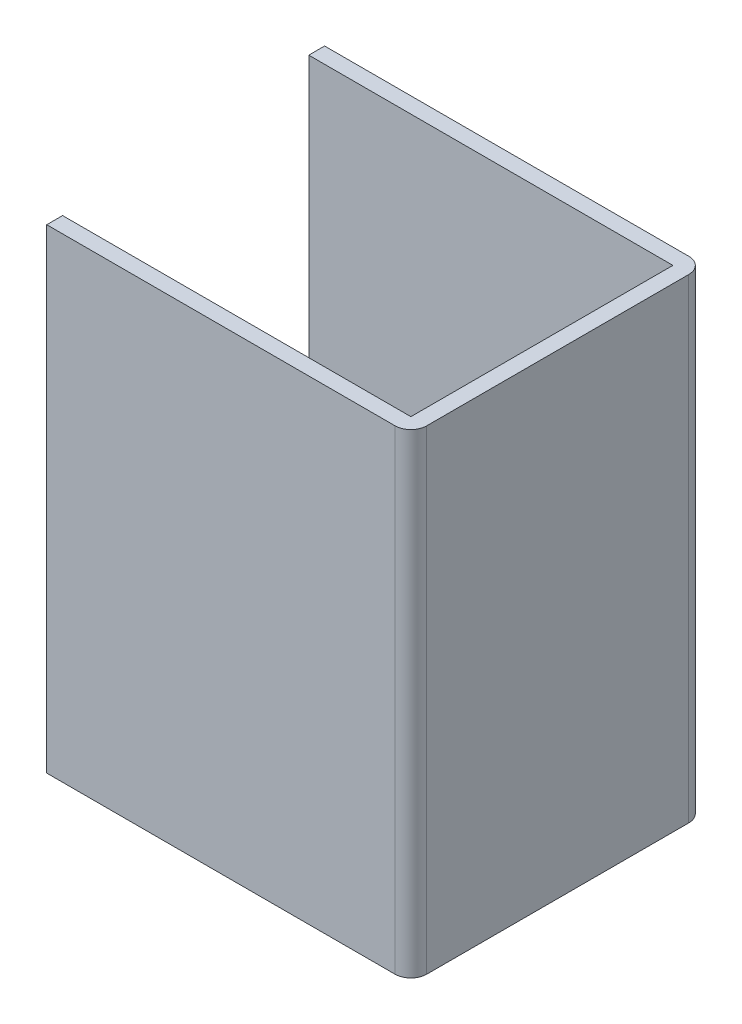
ISO-10303-21;
HEADER;
FILE_DESCRIPTION(('STEP AP214'),'2;1');
FILE_NAME('part.step','',(''),(''),'','','');
FILE_SCHEMA(('AUTOMOTIVE_DESIGN { 1 0 10303 214 1 1 1 1 }'));
ENDSEC;
DATA;
#1=APPLICATION_CONTEXT('core data for automotive mechanical design processes');
#2=APPLICATION_PROTOCOL_DEFINITION('international standard','automotive_design',2000,#1);
#3=PRODUCT_CONTEXT('',#1,'mechanical');
#4=PRODUCT('Part','Part','',(#3));
#5=PRODUCT_RELATED_PRODUCT_CATEGORY('part','',(#4));
#6=PRODUCT_DEFINITION_FORMATION('','',#4);
#7=PRODUCT_DEFINITION_CONTEXT('part definition',#1,'design');
#8=PRODUCT_DEFINITION('design','',#6,#7);
#9=PRODUCT_DEFINITION_SHAPE('','',#8);
#10=(LENGTH_UNIT() NAMED_UNIT(*) SI_UNIT(.MILLI.,.METRE.));
#11=(NAMED_UNIT(*) PLANE_ANGLE_UNIT() SI_UNIT($,.RADIAN.));
#12=(NAMED_UNIT(*) SI_UNIT($,.STERADIAN.) SOLID_ANGLE_UNIT());
#13=UNCERTAINTY_MEASURE_WITH_UNIT(LENGTH_MEASURE(1.E-05),#10,'distance_accuracy_value','');
#14=(GEOMETRIC_REPRESENTATION_CONTEXT(3) GLOBAL_UNCERTAINTY_ASSIGNED_CONTEXT((#13)) GLOBAL_UNIT_ASSIGNED_CONTEXT((#10,
#11,#12)) REPRESENTATION_CONTEXT('',''));
#15=CARTESIAN_POINT('',(0.,0.,0.));
#16=DIRECTION('',(0.,0.,1.));
#17=DIRECTION('',(1.,0.,0.));
#18=AXIS2_PLACEMENT_3D('',#15,#16,#17);
#19=CARTESIAN_POINT('',(3.2,-1.5,1.755));
#20=DIRECTION('',(1.,0.,0.));
#21=DIRECTION('',(0.,0.,-1.));
#22=AXIS2_PLACEMENT_3D('',#19,#20,#21);
#23=PLANE('',#22);
#24=DIRECTION('',(0.,0.,-1.));
#25=VECTOR('',#24,1.);
#26=CARTESIAN_POINT('',(3.2,1.5,1.755));
#27=LINE('',#26,#25);
#28=CARTESIAN_POINT('',(3.2,1.5,1.755));
#29=VERTEX_POINT('',#28);
#30=CARTESIAN_POINT('',(3.2,1.5,1.855));
#31=VERTEX_POINT('',#30);
#32=EDGE_CURVE('E76',#29,#31,#27,.F.);
#33=ORIENTED_EDGE('',*,*,#32,.F.);
#34=DIRECTION('',(0.,1.,0.));
#35=VECTOR('',#34,1.);
#36=CARTESIAN_POINT('',(3.2,-1.5,1.755));
#37=LINE('',#36,#35);
#38=CARTESIAN_POINT('',(3.2,-1.5,1.755));
#39=VERTEX_POINT('',#38);
#40=EDGE_CURVE('E100',#29,#39,#37,.F.);
#41=ORIENTED_EDGE('',*,*,#40,.T.);
#42=DIRECTION('',(0.,0.,-1.));
#43=VECTOR('',#42,1.);
#44=CARTESIAN_POINT('',(3.2,-1.5,1.755));
#45=LINE('',#44,#43);
#46=CARTESIAN_POINT('',(3.2,-1.5,1.855));
#47=VERTEX_POINT('',#46);
#48=EDGE_CURVE('E92',#47,#39,#45,.T.);
#49=ORIENTED_EDGE('',*,*,#48,.F.);
#50=DIRECTION('',(0.,1.,0.));
#51=VECTOR('',#50,1.);
#52=CARTESIAN_POINT('',(3.2,0.,1.855));
#53=LINE('',#52,#51);
#54=EDGE_CURVE('E97',#31,#47,#53,.F.);
#55=ORIENTED_EDGE('',*,*,#54,.F.);
#56=EDGE_LOOP('',(#33,#41,#49,#55));
#57=FACE_BOUND('',#56,.T.);
#58=ADVANCED_FACE('F17',(#57),#23,.F.);
#59=CARTESIAN_POINT('',(5.4,-1.5,0.));
#60=DIRECTION('',(1.,0.,0.));
#61=DIRECTION('',(0.,0.,-1.));
#62=AXIS2_PLACEMENT_3D('',#59,#60,#61);
#63=PLANE('',#62);
#64=DIRECTION('',(0.,0.,-1.));
#65=VECTOR('',#64,1.);
#66=CARTESIAN_POINT('',(5.4,1.5,0.));
#67=LINE('',#66,#65);
#68=CARTESIAN_POINT('',(5.4,1.5,0.1));
#69=VERTEX_POINT('',#68);
#70=CARTESIAN_POINT('',(5.4,1.5,1.755));
#71=VERTEX_POINT('',#70);
#72=EDGE_CURVE('E160',#69,#71,#67,.F.);
#73=ORIENTED_EDGE('',*,*,#72,.F.);
#74=DIRECTION('',(0.,1.,0.));
#75=VECTOR('',#74,1.);
#76=CARTESIAN_POINT('',(5.4,-1.5,0.1));
#77=LINE('',#76,#75);
#78=CARTESIAN_POINT('',(5.4,-1.5,0.1));
#79=VERTEX_POINT('',#78);
#80=EDGE_CURVE('E108',#79,#69,#77,.T.);
#81=ORIENTED_EDGE('',*,*,#80,.F.);
#82=DIRECTION('',(0.,0.,-1.));
#83=VECTOR('',#82,1.);
#84=CARTESIAN_POINT('',(5.4,-1.5,0.));
#85=LINE('',#84,#83);
#86=CARTESIAN_POINT('',(5.4,-1.5,1.755));
#87=VERTEX_POINT('',#86);
#88=EDGE_CURVE('E157',#87,#79,#85,.T.);
#89=ORIENTED_EDGE('',*,*,#88,.F.);
#90=DIRECTION('',(0.,1.,0.));
#91=VECTOR('',#90,1.);
#92=CARTESIAN_POINT('',(5.4,-1.5,1.755));
#93=LINE('',#92,#91);
#94=EDGE_CURVE('E146',#87,#71,#93,.T.);
#95=ORIENTED_EDGE('',*,*,#94,.T.);
#96=EDGE_LOOP('',(#73,#81,#89,#95));
#97=FACE_BOUND('',#96,.T.);
#98=ADVANCED_FACE('F227',(#97),#63,.F.);
#99=CARTESIAN_POINT('',(5.4,-1.5,1.755));
#100=DIRECTION('',(0.,1.,0.));
#101=DIRECTION('',(0.,0.,1.));
#102=AXIS2_PLACEMENT_3D('',#99,#100,#101);
#103=CYLINDRICAL_SURFACE('',#102,0.1);
#104=DIRECTION('',(0.,1.,0.));
#105=VECTOR('',#104,1.);
#106=CARTESIAN_POINT('',(5.4,0.,1.855));
#107=LINE('',#106,#105);
#108=CARTESIAN_POINT('',(5.4,-1.5,1.855));
#109=VERTEX_POINT('',#108);
#110=CARTESIAN_POINT('',(5.4,1.5,1.855));
#111=VERTEX_POINT('',#110);
#112=EDGE_CURVE('E109',#109,#111,#107,.T.);
#113=ORIENTED_EDGE('',*,*,#112,.F.);
#114=CARTESIAN_POINT('',(5.4,-1.5,1.755));
#115=DIRECTION('',(0.,1.,0.));
#116=DIRECTION('',(0.,0.,1.));
#117=AXIS2_PLACEMENT_3D('',#114,#115,#116);
#118=CIRCLE('',#117,0.1);
#119=CARTESIAN_POINT('',(5.5,-1.5,1.755));
#120=VERTEX_POINT('',#119);
#121=EDGE_CURVE('E113',#109,#120,#118,.T.);
#122=ORIENTED_EDGE('',*,*,#121,.T.);
#123=DIRECTION('',(0.,1.,0.));
#124=VECTOR('',#123,1.);
#125=CARTESIAN_POINT('',(5.5,-1.5,1.755));
#126=LINE('',#125,#124);
#127=CARTESIAN_POINT('',(5.5,1.5,1.755));
#128=VERTEX_POINT('',#127);
#129=EDGE_CURVE('E119',#128,#120,#126,.F.);
#130=ORIENTED_EDGE('',*,*,#129,.F.);
#131=CARTESIAN_POINT('',(5.4,1.5,1.755));
#132=DIRECTION('',(0.,1.,0.));
#133=DIRECTION('',(0.,0.,1.));
#134=AXIS2_PLACEMENT_3D('',#131,#132,#133);
#135=CIRCLE('',#134,0.1);
#136=EDGE_CURVE('E20',#128,#111,#135,.F.);
#137=ORIENTED_EDGE('',*,*,#136,.T.);
#138=EDGE_LOOP('',(#113,#122,#130,#137));
#139=FACE_BOUND('',#138,.T.);
#140=ADVANCED_FACE('F187',(#139),#103,.T.);
#141=CARTESIAN_POINT('',(4.35,0.,1.855));
#142=DIRECTION('',(0.,0.,1.));
#143=DIRECTION('',(1.,0.,0.));
#144=AXIS2_PLACEMENT_3D('',#141,#142,#143);
#145=PLANE('',#144);
#146=DIRECTION('',(-1.,0.,0.));
#147=VECTOR('',#146,1.);
#148=CARTESIAN_POINT('',(4.595623547637,1.5,1.855));
#149=LINE('',#148,#147);
#150=EDGE_CURVE('E107',#31,#111,#149,.F.);
#151=ORIENTED_EDGE('',*,*,#150,.F.);
#152=ORIENTED_EDGE('',*,*,#54,.T.);
#153=DIRECTION('',(1.,0.,0.));
#154=VECTOR('',#153,1.);
#155=CARTESIAN_POINT('',(4.595623547637,-1.5,1.855));
#156=LINE('',#155,#154);
#157=EDGE_CURVE('E106',#109,#47,#156,.F.);
#158=ORIENTED_EDGE('',*,*,#157,.F.);
#159=ORIENTED_EDGE('',*,*,#112,.T.);
#160=EDGE_LOOP('',(#151,#152,#158,#159));
#161=FACE_BOUND('',#160,.T.);
#162=ADVANCED_FACE('F105',(#161),#145,.T.);
#163=CARTESIAN_POINT('',(3.1,-1.5,0.1));
#164=DIRECTION('',(0.,0.,1.));
#165=DIRECTION('',(1.,0.,0.));
#166=AXIS2_PLACEMENT_3D('',#163,#164,#165);
#167=PLANE('',#166);
#168=ORIENTED_EDGE('',*,*,#80,.T.);
#169=DIRECTION('',(-1.,0.,0.));
#170=VECTOR('',#169,1.);
#171=CARTESIAN_POINT('',(4.595623547637,1.5,0.1));
#172=LINE('',#171,#170);
#173=CARTESIAN_POINT('',(3.1,1.5,0.1));
#174=VERTEX_POINT('',#173);
#175=EDGE_CURVE('E137',#174,#69,#172,.F.);
#176=ORIENTED_EDGE('',*,*,#175,.F.);
#177=DIRECTION('',(0.,1.,0.));
#178=VECTOR('',#177,1.);
#179=CARTESIAN_POINT('',(3.1,-1.5,0.1));
#180=LINE('',#179,#178);
#181=CARTESIAN_POINT('',(3.1,-1.5,0.1));
#182=VERTEX_POINT('',#181);
#183=EDGE_CURVE('E131',#174,#182,#180,.F.);
#184=ORIENTED_EDGE('',*,*,#183,.T.);
#185=DIRECTION('',(1.,0.,0.));
#186=VECTOR('',#185,1.);
#187=CARTESIAN_POINT('',(4.595623547637,-1.5,0.1));
#188=LINE('',#187,#186);
#189=EDGE_CURVE('E117',#79,#182,#188,.F.);
#190=ORIENTED_EDGE('',*,*,#189,.F.);
#191=EDGE_LOOP('',(#168,#176,#184,#190));
#192=FACE_BOUND('',#191,.T.);
#193=ADVANCED_FACE('F230',(#192),#167,.T.);
#194=CARTESIAN_POINT('',(3.2,-1.5,1.755));
#195=DIRECTION('',(0.,0.,1.));
#196=DIRECTION('',(1.,0.,0.));
#197=AXIS2_PLACEMENT_3D('',#194,#195,#196);
#198=PLANE('',#197);
#199=ORIENTED_EDGE('',*,*,#94,.F.);
#200=DIRECTION('',(1.,0.,0.));
#201=VECTOR('',#200,1.);
#202=CARTESIAN_POINT('',(4.595623547637,-1.5,1.755));
#203=LINE('',#202,#201);
#204=EDGE_CURVE('E114',#39,#87,#203,.T.);
#205=ORIENTED_EDGE('',*,*,#204,.F.);
#206=ORIENTED_EDGE('',*,*,#40,.F.);
#207=DIRECTION('',(-1.,0.,0.));
#208=VECTOR('',#207,1.);
#209=CARTESIAN_POINT('',(4.595623547637,1.5,1.755));
#210=LINE('',#209,#208);
#211=EDGE_CURVE('E140',#71,#29,#210,.T.);
#212=ORIENTED_EDGE('',*,*,#211,.F.);
#213=EDGE_LOOP('',(#199,#205,#206,#212));
#214=FACE_BOUND('',#213,.T.);
#215=ADVANCED_FACE('F236',(#214),#198,.F.);
#216=CARTESIAN_POINT('',(5.5,-1.5,0.));
#217=DIRECTION('',(1.,0.,0.));
#218=DIRECTION('',(0.,0.,-1.));
#219=AXIS2_PLACEMENT_3D('',#216,#217,#218);
#220=PLANE('',#219);
#221=DIRECTION('',(0.,0.,1.));
#222=VECTOR('',#221,1.);
#223=CARTESIAN_POINT('',(5.5,1.5,0.913905886909));
#224=LINE('',#223,#222);
#225=CARTESIAN_POINT('',(5.5,1.5,0.1));
#226=VERTEX_POINT('',#225);
#227=EDGE_CURVE('E193',#128,#226,#224,.F.);
#228=ORIENTED_EDGE('',*,*,#227,.F.);
#229=ORIENTED_EDGE('',*,*,#129,.T.);
#230=DIRECTION('',(0.,0.,1.));
#231=VECTOR('',#230,1.);
#232=CARTESIAN_POINT('',(5.5,-1.5,0.913905886909));
#233=LINE('',#232,#231);
#234=CARTESIAN_POINT('',(5.5,-1.5,0.1));
#235=VERTEX_POINT('',#234);
#236=EDGE_CURVE('E115',#235,#120,#233,.T.);
#237=ORIENTED_EDGE('',*,*,#236,.F.);
#238=DIRECTION('',(0.,1.,0.));
#239=VECTOR('',#238,1.);
#240=CARTESIAN_POINT('',(5.5,-1.5,0.1));
#241=LINE('',#240,#239);
#242=EDGE_CURVE('E127',#226,#235,#241,.F.);
#243=ORIENTED_EDGE('',*,*,#242,.F.);
#244=EDGE_LOOP('',(#228,#229,#237,#243));
#245=FACE_BOUND('',#244,.T.);
#246=ADVANCED_FACE('F190',(#245),#220,.T.);
#247=CARTESIAN_POINT('',(4.595623547637,-1.5,0.913905886909));
#248=DIRECTION('',(0.,-1.,0.));
#249=DIRECTION('',(1.,0.,0.));
#250=AXIS2_PLACEMENT_3D('',#247,#248,#249);
#251=PLANE('',#250);
#252=ORIENTED_EDGE('',*,*,#189,.T.);
#253=DIRECTION('',(0.,0.,-1.));
#254=VECTOR('',#253,1.);
#255=CARTESIAN_POINT('',(3.1,-1.5,0.));
#256=LINE('',#255,#254);
#257=CARTESIAN_POINT('',(3.1,-1.5,0.));
#258=VERTEX_POINT('',#257);
#259=EDGE_CURVE('E134',#182,#258,#256,.T.);
#260=ORIENTED_EDGE('',*,*,#259,.T.);
#261=DIRECTION('',(-1.,0.,0.));
#262=VECTOR('',#261,1.);
#263=CARTESIAN_POINT('',(4.3,-1.5,0.));
#264=LINE('',#263,#262);
#265=CARTESIAN_POINT('',(5.4,-1.5,0.));
#266=VERTEX_POINT('',#265);
#267=EDGE_CURVE('E130',#266,#258,#264,.T.);
#268=ORIENTED_EDGE('',*,*,#267,.F.);
#269=CARTESIAN_POINT('',(5.4,-1.5,0.1));
#270=DIRECTION('',(0.,1.,0.));
#271=DIRECTION('',(0.,0.,1.));
#272=AXIS2_PLACEMENT_3D('',#269,#270,#271);
#273=CIRCLE('',#272,0.1);
#274=EDGE_CURVE('E177',#235,#266,#273,.T.);
#275=ORIENTED_EDGE('',*,*,#274,.F.);
#276=ORIENTED_EDGE('',*,*,#236,.T.);
#277=ORIENTED_EDGE('',*,*,#121,.F.);
#278=ORIENTED_EDGE('',*,*,#157,.T.);
#279=ORIENTED_EDGE('',*,*,#48,.T.);
#280=ORIENTED_EDGE('',*,*,#204,.T.);
#281=ORIENTED_EDGE('',*,*,#88,.T.);
#282=EDGE_LOOP('',(#252,#260,#268,#275,#276,#277,#278,#279,#280,#281));
#283=FACE_BOUND('',#282,.T.);
#284=ADVANCED_FACE('F111',(#283),#251,.T.);
#285=CARTESIAN_POINT('',(3.1,-1.5,0.));
#286=DIRECTION('',(1.,0.,0.));
#287=DIRECTION('',(0.,0.,-1.));
#288=AXIS2_PLACEMENT_3D('',#285,#286,#287);
#289=PLANE('',#288);
#290=DIRECTION('',(0.,0.,1.));
#291=VECTOR('',#290,1.);
#292=CARTESIAN_POINT('',(3.1,1.5,0.913905886909));
#293=LINE('',#292,#291);
#294=CARTESIAN_POINT('',(3.1,1.5,0.));
#295=VERTEX_POINT('',#294);
#296=EDGE_CURVE('E141',#295,#174,#293,.T.);
#297=ORIENTED_EDGE('',*,*,#296,.F.);
#298=DIRECTION('',(0.,1.,0.));
#299=VECTOR('',#298,1.);
#300=CARTESIAN_POINT('',(3.1,0.,0.));
#301=LINE('',#300,#299);
#302=EDGE_CURVE('E203',#258,#295,#301,.T.);
#303=ORIENTED_EDGE('',*,*,#302,.F.);
#304=ORIENTED_EDGE('',*,*,#259,.F.);
#305=ORIENTED_EDGE('',*,*,#183,.F.);
#306=EDGE_LOOP('',(#297,#303,#304,#305));
#307=FACE_BOUND('',#306,.T.);
#308=ADVANCED_FACE('F232',(#307),#289,.F.);
#309=CARTESIAN_POINT('',(4.595623547637,1.5,0.913905886909));
#310=DIRECTION('',(0.,1.,0.));
#311=DIRECTION('',(-1.,0.,0.));
#312=AXIS2_PLACEMENT_3D('',#309,#310,#311);
#313=PLANE('',#312);
#314=ORIENTED_EDGE('',*,*,#211,.T.);
#315=ORIENTED_EDGE('',*,*,#32,.T.);
#316=ORIENTED_EDGE('',*,*,#150,.T.);
#317=ORIENTED_EDGE('',*,*,#136,.F.);
#318=ORIENTED_EDGE('',*,*,#227,.T.);
#319=CARTESIAN_POINT('',(5.4,1.5,0.1));
#320=DIRECTION('',(0.,1.,0.));
#321=DIRECTION('',(0.,0.,1.));
#322=AXIS2_PLACEMENT_3D('',#319,#320,#321);
#323=CIRCLE('',#322,0.1);
#324=CARTESIAN_POINT('',(5.4,1.5,0.));
#325=VERTEX_POINT('',#324);
#326=EDGE_CURVE('E35',#325,#226,#323,.F.);
#327=ORIENTED_EDGE('',*,*,#326,.F.);
#328=DIRECTION('',(-1.,0.,0.));
#329=VECTOR('',#328,1.);
#330=CARTESIAN_POINT('',(4.3,1.5,0.));
#331=LINE('',#330,#329);
#332=EDGE_CURVE('E26',#295,#325,#331,.F.);
#333=ORIENTED_EDGE('',*,*,#332,.F.);
#334=ORIENTED_EDGE('',*,*,#296,.T.);
#335=ORIENTED_EDGE('',*,*,#175,.T.);
#336=ORIENTED_EDGE('',*,*,#72,.T.);
#337=EDGE_LOOP('',(#314,#315,#316,#317,#318,#327,#333,#334,#335,#336));
#338=FACE_BOUND('',#337,.T.);
#339=ADVANCED_FACE('F233',(#338),#313,.T.);
#340=CARTESIAN_POINT('',(5.4,-1.5,0.1));
#341=DIRECTION('',(0.,1.,0.));
#342=DIRECTION('',(0.,0.,1.));
#343=AXIS2_PLACEMENT_3D('',#340,#341,#342);
#344=CYLINDRICAL_SURFACE('',#343,0.1);
#345=ORIENTED_EDGE('',*,*,#326,.T.);
#346=ORIENTED_EDGE('',*,*,#242,.T.);
#347=ORIENTED_EDGE('',*,*,#274,.T.);
#348=DIRECTION('',(0.,1.,0.));
#349=VECTOR('',#348,1.);
#350=CARTESIAN_POINT('',(5.4,0.,0.));
#351=LINE('',#350,#349);
#352=EDGE_CURVE('E11',#325,#266,#351,.F.);
#353=ORIENTED_EDGE('',*,*,#352,.F.);
#354=EDGE_LOOP('',(#345,#346,#347,#353));
#355=FACE_BOUND('',#354,.T.);
#356=ADVANCED_FACE('F197',(#355),#344,.T.);
#357=CARTESIAN_POINT('',(4.3,0.,0.));
#358=DIRECTION('',(0.,0.,-1.));
#359=DIRECTION('',(-1.,0.,0.));
#360=AXIS2_PLACEMENT_3D('',#357,#358,#359);
#361=PLANE('',#360);
#362=ORIENTED_EDGE('',*,*,#332,.T.);
#363=ORIENTED_EDGE('',*,*,#352,.T.);
#364=ORIENTED_EDGE('',*,*,#267,.T.);
#365=ORIENTED_EDGE('',*,*,#302,.T.);
#366=EDGE_LOOP('',(#362,#363,#364,#365));
#367=FACE_BOUND('',#366,.T.);
#368=ADVANCED_FACE('F201',(#367),#361,.T.);
#369=CLOSED_SHELL('',(#58,#98,#140,#162,#193,#215,#246,#284,#308,#339,#356,#368));
#370=MANIFOLD_SOLID_BREP('B1',#369);
#371=ADVANCED_BREP_SHAPE_REPRESENTATION('',(#18,#370),#14);
#372=SHAPE_DEFINITION_REPRESENTATION(#9,#371);
ENDSEC;
END-ISO-10303-21;
